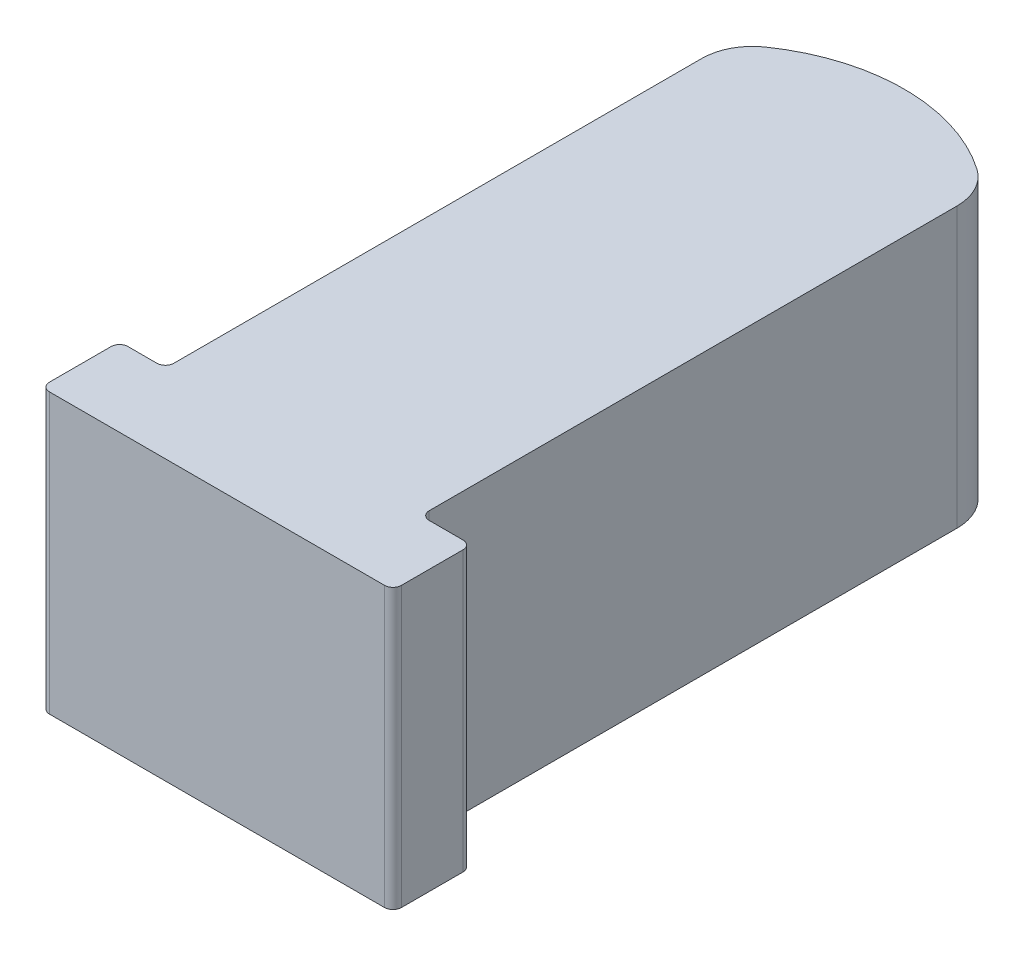
ISO-10303-21;
HEADER;
FILE_DESCRIPTION(('STEP AP214'),'2;1');
FILE_NAME('part.step','',(''),(''),'','','');
FILE_SCHEMA(('AUTOMOTIVE_DESIGN { 1 0 10303 214 1 1 1 1 }'));
ENDSEC;
DATA;
#1=APPLICATION_CONTEXT('core data for automotive mechanical design processes');
#2=APPLICATION_PROTOCOL_DEFINITION('international standard','automotive_design',2000,#1);
#3=PRODUCT_CONTEXT('',#1,'mechanical');
#4=PRODUCT('Part','Part','',(#3));
#5=PRODUCT_RELATED_PRODUCT_CATEGORY('part','',(#4));
#6=PRODUCT_DEFINITION_FORMATION('','',#4);
#7=PRODUCT_DEFINITION_CONTEXT('part definition',#1,'design');
#8=PRODUCT_DEFINITION('design','',#6,#7);
#9=PRODUCT_DEFINITION_SHAPE('','',#8);
#10=(LENGTH_UNIT() NAMED_UNIT(*) SI_UNIT(.MILLI.,.METRE.));
#11=(NAMED_UNIT(*) PLANE_ANGLE_UNIT() SI_UNIT($,.RADIAN.));
#12=(NAMED_UNIT(*) SI_UNIT($,.STERADIAN.) SOLID_ANGLE_UNIT());
#13=UNCERTAINTY_MEASURE_WITH_UNIT(LENGTH_MEASURE(1.E-05),#10,'distance_accuracy_value','');
#14=(GEOMETRIC_REPRESENTATION_CONTEXT(3) GLOBAL_UNCERTAINTY_ASSIGNED_CONTEXT((#13)) GLOBAL_UNIT_ASSIGNED_CONTEXT((#10,
#11,#12)) REPRESENTATION_CONTEXT('',''));
#15=CARTESIAN_POINT('',(0.,0.,0.));
#16=DIRECTION('',(0.,0.,1.));
#17=DIRECTION('',(1.,0.,0.));
#18=AXIS2_PLACEMENT_3D('',#15,#16,#17);
#19=CARTESIAN_POINT('',(-7.28235213915439,6.8,-3.32500001229346));
#20=DIRECTION('',(0.,-1.,0.));
#21=DIRECTION('',(0.,0.,-1.));
#22=AXIS2_PLACEMENT_3D('',#19,#20,#21);
#23=CYLINDRICAL_SURFACE('',#22,0.1);
#24=CARTESIAN_POINT('',(-7.28235213915439,6.8,-3.32500001229346));
#25=DIRECTION('',(0.,-1.,0.));
#26=DIRECTION('',(0.,0.,-1.));
#27=AXIS2_PLACEMENT_3D('',#24,#25,#26);
#28=CIRCLE('',#27,0.1);
#29=CARTESIAN_POINT('',(-7.28235213915439,6.8,-3.42500001229346));
#30=VERTEX_POINT('',#29);
#31=CARTESIAN_POINT('',(-7.18235213915439,6.8,-3.32500001229346));
#32=VERTEX_POINT('',#31);
#33=EDGE_CURVE('E137',#30,#32,#28,.T.);
#34=ORIENTED_EDGE('',*,*,#33,.T.);
#35=DIRECTION('',(0.,1.,0.));
#36=VECTOR('',#35,1.);
#37=CARTESIAN_POINT('',(-7.18235213915439,5.15,-3.32500001229346));
#38=LINE('',#37,#36);
#39=CARTESIAN_POINT('',(-7.18235213915439,3.5,-3.32500001229346));
#40=VERTEX_POINT('',#39);
#41=EDGE_CURVE('E139',#40,#32,#38,.T.);
#42=ORIENTED_EDGE('',*,*,#41,.F.);
#43=CARTESIAN_POINT('',(-7.28235213915439,3.5,-3.32500001229346));
#44=DIRECTION('',(0.,-1.,0.));
#45=DIRECTION('',(0.,0.,-1.));
#46=AXIS2_PLACEMENT_3D('',#43,#44,#45);
#47=CIRCLE('',#46,0.1);
#48=CARTESIAN_POINT('',(-7.28235213915439,3.5,-3.42500001229346));
#49=VERTEX_POINT('',#48);
#50=EDGE_CURVE('E21',#40,#49,#47,.F.);
#51=ORIENTED_EDGE('',*,*,#50,.T.);
#52=DIRECTION('',(0.,-1.,0.));
#53=VECTOR('',#52,1.);
#54=CARTESIAN_POINT('',(-7.28235213915439,5.15,-3.42500001229346));
#55=LINE('',#54,#53);
#56=EDGE_CURVE('E152',#30,#49,#55,.T.);
#57=ORIENTED_EDGE('',*,*,#56,.F.);
#58=EDGE_LOOP('',(#34,#42,#51,#57));
#59=FACE_BOUND('',#58,.T.);
#60=ADVANCED_FACE('F17',(#59),#23,.T.);
#61=CARTESIAN_POINT('',(-7.18235213915439,3.49,-2.58665948518661));
#62=DIRECTION('',(1.,0.,0.));
#63=DIRECTION('',(0.,0.,-1.));
#64=AXIS2_PLACEMENT_3D('',#61,#62,#63);
#65=PLANE('',#64);
#66=DIRECTION('',(0.,0.,1.));
#67=VECTOR('',#66,1.);
#68=CARTESIAN_POINT('',(-7.18235213915439,6.8,-2.96082974874003));
#69=LINE('',#68,#67);
#70=CARTESIAN_POINT('',(-7.18235213915439,6.8,-2.59665948518661));
#71=VERTEX_POINT('',#70);
#72=EDGE_CURVE('E142',#32,#71,#69,.T.);
#73=ORIENTED_EDGE('',*,*,#72,.T.);
#74=DIRECTION('',(0.,1.,0.));
#75=VECTOR('',#74,1.);
#76=CARTESIAN_POINT('',(-7.18235213915439,5.15,-2.59665948518661));
#77=LINE('',#76,#75);
#78=CARTESIAN_POINT('',(-7.18235213915439,3.5,-2.59665948518661));
#79=VERTEX_POINT('',#78);
#80=EDGE_CURVE('E146',#79,#71,#77,.T.);
#81=ORIENTED_EDGE('',*,*,#80,.F.);
#82=DIRECTION('',(0.,0.,-1.));
#83=VECTOR('',#82,1.);
#84=CARTESIAN_POINT('',(-7.18235213915439,3.5,-2.96082974874003));
#85=LINE('',#84,#83);
#86=EDGE_CURVE('E130',#79,#40,#85,.T.);
#87=ORIENTED_EDGE('',*,*,#86,.T.);
#88=ORIENTED_EDGE('',*,*,#41,.T.);
#89=EDGE_LOOP('',(#73,#81,#87,#88));
#90=FACE_BOUND('',#89,.T.);
#91=ADVANCED_FACE('F144',(#90),#65,.T.);
#92=CARTESIAN_POINT('',(-7.27235213915439,3.49,-3.42500001229346));
#93=DIRECTION('',(0.,0.,-1.));
#94=DIRECTION('',(-1.,0.,0.));
#95=AXIS2_PLACEMENT_3D('',#92,#93,#94);
#96=PLANE('',#95);
#97=DIRECTION('',(1.,0.,0.));
#98=VECTOR('',#97,1.);
#99=CARTESIAN_POINT('',(-7.48235213244887,6.8,-3.42500001229346));
#100=LINE('',#99,#98);
#101=CARTESIAN_POINT('',(-7.68235212574335,6.8,-3.42500001229346));
#102=VERTEX_POINT('',#101);
#103=EDGE_CURVE('E154',#102,#30,#100,.T.);
#104=ORIENTED_EDGE('',*,*,#103,.T.);
#105=ORIENTED_EDGE('',*,*,#56,.T.);
#106=DIRECTION('',(-1.,0.,0.));
#107=VECTOR('',#106,1.);
#108=CARTESIAN_POINT('',(-7.48235213244887,3.5,-3.42500001229346));
#109=LINE('',#108,#107);
#110=CARTESIAN_POINT('',(-7.68235212574334,3.5,-3.42500001229346));
#111=VERTEX_POINT('',#110);
#112=EDGE_CURVE('E133',#49,#111,#109,.T.);
#113=ORIENTED_EDGE('',*,*,#112,.T.);
#114=DIRECTION('',(0.,-1.,0.));
#115=VECTOR('',#114,1.);
#116=CARTESIAN_POINT('',(-7.68235212574334,5.15,-3.42500001229346));
#117=LINE('',#116,#115);
#118=EDGE_CURVE('E193',#102,#111,#117,.T.);
#119=ORIENTED_EDGE('',*,*,#118,.F.);
#120=EDGE_LOOP('',(#104,#105,#113,#119));
#121=FACE_BOUND('',#120,.T.);
#122=ADVANCED_FACE('F291',(#121),#96,.T.);
#123=CARTESIAN_POINT('',(-7.28235213915439,6.8,-2.59665948518661));
#124=DIRECTION('',(0.,-1.,0.));
#125=DIRECTION('',(0.,0.,-1.));
#126=AXIS2_PLACEMENT_3D('',#123,#124,#125);
#127=CYLINDRICAL_SURFACE('',#126,0.1);
#128=CARTESIAN_POINT('',(-7.28235213915439,6.8,-2.59665948518661));
#129=DIRECTION('',(0.,-1.,0.));
#130=DIRECTION('',(0.,0.,-1.));
#131=AXIS2_PLACEMENT_3D('',#128,#129,#130);
#132=CIRCLE('',#131,0.1);
#133=CARTESIAN_POINT('',(-7.28235213915439,6.8,-2.49665948518661));
#134=VERTEX_POINT('',#133);
#135=EDGE_CURVE('E199',#71,#134,#132,.T.);
#136=ORIENTED_EDGE('',*,*,#135,.T.);
#137=DIRECTION('',(0.,1.,0.));
#138=VECTOR('',#137,1.);
#139=CARTESIAN_POINT('',(-7.28235213915439,5.15,-2.49665948518661));
#140=LINE('',#139,#138);
#141=CARTESIAN_POINT('',(-7.28235213915439,3.5,-2.49665948518661));
#142=VERTEX_POINT('',#141);
#143=EDGE_CURVE('E190',#142,#134,#140,.T.);
#144=ORIENTED_EDGE('',*,*,#143,.F.);
#145=CARTESIAN_POINT('',(-7.28235213915439,3.5,-2.59665948518661));
#146=DIRECTION('',(0.,-1.,0.));
#147=DIRECTION('',(0.,0.,-1.));
#148=AXIS2_PLACEMENT_3D('',#145,#146,#147);
#149=CIRCLE('',#148,0.1);
#150=EDGE_CURVE('E153',#142,#79,#149,.F.);
#151=ORIENTED_EDGE('',*,*,#150,.T.);
#152=ORIENTED_EDGE('',*,*,#80,.T.);
#153=EDGE_LOOP('',(#136,#144,#151,#152));
#154=FACE_BOUND('',#153,.T.);
#155=ADVANCED_FACE('F294',(#154),#127,.T.);
#156=CARTESIAN_POINT('',(-7.68235212574334,3.5,-3.52500001229346));
#157=DIRECTION('',(0.,1.,0.));
#158=DIRECTION('',(0.,0.,1.));
#159=AXIS2_PLACEMENT_3D('',#156,#157,#158);
#160=CYLINDRICAL_SURFACE('',#159,0.100000000000006);
#161=CARTESIAN_POINT('',(-7.68235212574336,6.8,-3.52500001229345));
#162=DIRECTION('',(0.,1.,0.));
#163=DIRECTION('',(0.,0.,1.));
#164=AXIS2_PLACEMENT_3D('',#161,#162,#163);
#165=CIRCLE('',#164,0.100000000000006);
#166=CARTESIAN_POINT('',(-7.78235212574335,6.8,-3.52500001229345));
#167=VERTEX_POINT('',#166);
#168=EDGE_CURVE('E194',#167,#102,#165,.T.);
#169=ORIENTED_EDGE('',*,*,#168,.T.);
#170=ORIENTED_EDGE('',*,*,#118,.T.);
#171=CARTESIAN_POINT('',(-7.68235212574334,3.5,-3.52500001229346));
#172=DIRECTION('',(0.,1.,0.));
#173=DIRECTION('',(0.,0.,1.));
#174=AXIS2_PLACEMENT_3D('',#171,#172,#173);
#175=CIRCLE('',#174,0.100000000000006);
#176=CARTESIAN_POINT('',(-7.78235212574336,3.5,-3.52500001229346));
#177=VERTEX_POINT('',#176);
#178=EDGE_CURVE('E197',#111,#177,#175,.F.);
#179=ORIENTED_EDGE('',*,*,#178,.T.);
#180=DIRECTION('',(0.,-1.,0.));
#181=VECTOR('',#180,1.);
#182=CARTESIAN_POINT('',(-7.78235212574335,5.15,-3.52500001229346));
#183=LINE('',#182,#181);
#184=EDGE_CURVE('E216',#167,#177,#183,.T.);
#185=ORIENTED_EDGE('',*,*,#184,.F.);
#186=EDGE_LOOP('',(#169,#170,#179,#185));
#187=FACE_BOUND('',#186,.T.);
#188=ADVANCED_FACE('F288',(#187),#160,.F.);
#189=CARTESIAN_POINT('',(-8.38235212574329,6.8,-9.76718775769763));
#190=DIRECTION('',(0.,-1.,0.));
#191=DIRECTION('',(0.,0.,-1.));
#192=AXIS2_PLACEMENT_3D('',#189,#190,#191);
#193=CYLINDRICAL_SURFACE('',#192,0.599999999999941);
#194=CARTESIAN_POINT('',(-8.38235212574329,6.8,-9.76718775769763));
#195=DIRECTION('',(0.,-1.,0.));
#196=DIRECTION('',(0.,0.,-1.));
#197=AXIS2_PLACEMENT_3D('',#194,#195,#196);
#198=CIRCLE('',#197,0.599999999999941);
#199=CARTESIAN_POINT('',(-8.04095619473779,6.8,-10.2605930862996));
#200=VERTEX_POINT('',#199);
#201=CARTESIAN_POINT('',(-7.78235212574336,6.8,-9.76718775769762));
#202=VERTEX_POINT('',#201);
#203=EDGE_CURVE('E188',#200,#202,#198,.T.);
#204=ORIENTED_EDGE('',*,*,#203,.T.);
#205=DIRECTION('',(0.,1.,0.));
#206=VECTOR('',#205,1.);
#207=CARTESIAN_POINT('',(-7.78235212574336,5.15,-9.76718775769761));
#208=LINE('',#207,#206);
#209=CARTESIAN_POINT('',(-7.78235212574336,3.5,-9.76718775769762));
#210=VERTEX_POINT('',#209);
#211=EDGE_CURVE('E213',#210,#202,#208,.T.);
#212=ORIENTED_EDGE('',*,*,#211,.F.);
#213=CARTESIAN_POINT('',(-8.38235212574329,3.5,-9.76718775769763));
#214=DIRECTION('',(0.,-1.,0.));
#215=DIRECTION('',(0.,0.,-1.));
#216=AXIS2_PLACEMENT_3D('',#213,#214,#215);
#217=CIRCLE('',#216,0.599999999999941);
#218=CARTESIAN_POINT('',(-8.04095619473779,3.5,-10.2605930862996));
#219=VERTEX_POINT('',#218);
#220=EDGE_CURVE('E191',#210,#219,#217,.F.);
#221=ORIENTED_EDGE('',*,*,#220,.T.);
#222=DIRECTION('',(0.,-1.,0.));
#223=VECTOR('',#222,1.);
#224=CARTESIAN_POINT('',(-8.04095619473745,5.15,-10.2605930862994));
#225=LINE('',#224,#223);
#226=EDGE_CURVE('E210',#200,#219,#225,.T.);
#227=ORIENTED_EDGE('',*,*,#226,.F.);
#228=EDGE_LOOP('',(#204,#212,#221,#227));
#229=FACE_BOUND('',#228,.T.);
#230=ADVANCED_FACE('F282',(#229),#193,.T.);
#231=CARTESIAN_POINT('',(-11.2541460953288,3.49,-2.49665948518661));
#232=DIRECTION('',(0.,0.,1.));
#233=DIRECTION('',(1.,0.,0.));
#234=AXIS2_PLACEMENT_3D('',#231,#232,#233);
#235=PLANE('',#234);
#236=DIRECTION('',(1.,0.,0.));
#237=VECTOR('',#236,1.);
#238=CARTESIAN_POINT('',(-9.2632491172416,6.8,-2.49665948518661));
#239=LINE('',#238,#237);
#240=CARTESIAN_POINT('',(-11.2441460953288,6.8,-2.49665948518661));
#241=VERTEX_POINT('',#240);
#242=EDGE_CURVE('E171',#241,#134,#239,.T.);
#243=ORIENTED_EDGE('',*,*,#242,.F.);
#244=DIRECTION('',(0.,1.,0.));
#245=VECTOR('',#244,1.);
#246=CARTESIAN_POINT('',(-11.2441460953288,5.15,-2.49665948518661));
#247=LINE('',#246,#245);
#248=CARTESIAN_POINT('',(-11.2441460953288,3.5,-2.49665948518661));
#249=VERTEX_POINT('',#248);
#250=EDGE_CURVE('E187',#249,#241,#247,.T.);
#251=ORIENTED_EDGE('',*,*,#250,.F.);
#252=DIRECTION('',(-1.,0.,0.));
#253=VECTOR('',#252,1.);
#254=CARTESIAN_POINT('',(-9.2632491172416,3.5,-2.49665948518661));
#255=LINE('',#254,#253);
#256=EDGE_CURVE('E176',#142,#249,#255,.T.);
#257=ORIENTED_EDGE('',*,*,#256,.F.);
#258=ORIENTED_EDGE('',*,*,#143,.T.);
#259=EDGE_LOOP('',(#243,#251,#257,#258));
#260=FACE_BOUND('',#259,.T.);
#261=ADVANCED_FACE('F297',(#260),#235,.T.);
#262=CARTESIAN_POINT('',(-7.78235212574335,3.49,-3.51500001229346));
#263=DIRECTION('',(1.,0.,0.));
#264=DIRECTION('',(0.,0.,-1.));
#265=AXIS2_PLACEMENT_3D('',#262,#263,#264);
#266=PLANE('',#265);
#267=DIRECTION('',(0.,0.,-1.));
#268=VECTOR('',#267,1.);
#269=CARTESIAN_POINT('',(-7.78235212574335,6.8,-6.81149957205211));
#270=LINE('',#269,#268);
#271=EDGE_CURVE('E167',#167,#202,#270,.T.);
#272=ORIENTED_EDGE('',*,*,#271,.F.);
#273=ORIENTED_EDGE('',*,*,#184,.T.);
#274=DIRECTION('',(0.,0.,1.));
#275=VECTOR('',#274,1.);
#276=CARTESIAN_POINT('',(-7.78235212574336,3.5,-6.81149957205211));
#277=LINE('',#276,#275);
#278=EDGE_CURVE('E180',#210,#177,#277,.T.);
#279=ORIENTED_EDGE('',*,*,#278,.F.);
#280=ORIENTED_EDGE('',*,*,#211,.T.);
#281=EDGE_LOOP('',(#272,#273,#279,#280));
#282=FACE_BOUND('',#281,.T.);
#283=ADVANCED_FACE('F285',(#282),#266,.T.);
#284=CARTESIAN_POINT('',(-9.29218367976023,6.8,-8.45224608407934));
#285=DIRECTION('',(0.,-1.,0.));
#286=DIRECTION('',(0.,0.,-1.));
#287=AXIS2_PLACEMENT_3D('',#284,#285,#286);
#288=CYLINDRICAL_SURFACE('',#287,2.19902003167654);
#289=CARTESIAN_POINT('',(-9.29218367976023,6.8,-8.45224608407934));
#290=DIRECTION('',(0.,-1.,0.));
#291=DIRECTION('',(0.,0.,-1.));
#292=AXIS2_PLACEMENT_3D('',#289,#290,#291);
#293=CIRCLE('',#292,2.19902003167654);
#294=CARTESIAN_POINT('',(-10.5434111647827,6.8,-10.2605930862996));
#295=VERTEX_POINT('',#294);
#296=EDGE_CURVE('E165',#200,#295,#293,.F.);
#297=ORIENTED_EDGE('',*,*,#296,.F.);
#298=ORIENTED_EDGE('',*,*,#226,.T.);
#299=CARTESIAN_POINT('',(-9.29218367976023,3.5,-8.45224608407934));
#300=DIRECTION('',(0.,-1.,0.));
#301=DIRECTION('',(0.,0.,-1.));
#302=AXIS2_PLACEMENT_3D('',#299,#300,#301);
#303=CIRCLE('',#302,2.19902003167654);
#304=CARTESIAN_POINT('',(-10.5434111647827,3.5,-10.2605930862996));
#305=VERTEX_POINT('',#304);
#306=EDGE_CURVE('E177',#305,#219,#303,.T.);
#307=ORIENTED_EDGE('',*,*,#306,.F.);
#308=DIRECTION('',(0.,-1.,0.));
#309=VECTOR('',#308,1.);
#310=CARTESIAN_POINT('',(-10.543411164783,5.15,-10.2605930862994));
#311=LINE('',#310,#309);
#312=EDGE_CURVE('E159',#295,#305,#311,.T.);
#313=ORIENTED_EDGE('',*,*,#312,.F.);
#314=EDGE_LOOP('',(#297,#298,#307,#313));
#315=FACE_BOUND('',#314,.T.);
#316=ADVANCED_FACE('F278',(#315),#288,.T.);
#317=CARTESIAN_POINT('',(-11.2441460953288,6.8,-2.59665948518661));
#318=DIRECTION('',(0.,-1.,0.));
#319=DIRECTION('',(0.,0.,-1.));
#320=AXIS2_PLACEMENT_3D('',#317,#318,#319);
#321=CYLINDRICAL_SURFACE('',#320,0.100000000000001);
#322=CARTESIAN_POINT('',(-11.2441460953288,6.8,-2.59665948518661));
#323=DIRECTION('',(0.,-1.,0.));
#324=DIRECTION('',(0.,0.,-1.));
#325=AXIS2_PLACEMENT_3D('',#322,#323,#324);
#326=CIRCLE('',#325,0.100000000000001);
#327=CARTESIAN_POINT('',(-11.3441460953288,6.8,-2.59665948518661));
#328=VERTEX_POINT('',#327);
#329=EDGE_CURVE('E168',#328,#241,#326,.F.);
#330=ORIENTED_EDGE('',*,*,#329,.F.);
#331=DIRECTION('',(0.,1.,0.));
#332=VECTOR('',#331,1.);
#333=CARTESIAN_POINT('',(-11.3441460953288,5.15,-2.59665948518661));
#334=LINE('',#333,#332);
#335=CARTESIAN_POINT('',(-11.3441460953288,3.5,-2.59665948518662));
#336=VERTEX_POINT('',#335);
#337=EDGE_CURVE('E229',#336,#328,#334,.T.);
#338=ORIENTED_EDGE('',*,*,#337,.F.);
#339=CARTESIAN_POINT('',(-11.2441460953288,3.5,-2.59665948518664));
#340=DIRECTION('',(0.,-1.,0.));
#341=DIRECTION('',(0.,0.,-1.));
#342=AXIS2_PLACEMENT_3D('',#339,#340,#341);
#343=CIRCLE('',#342,0.100000000000001);
#344=EDGE_CURVE('E174',#249,#336,#343,.T.);
#345=ORIENTED_EDGE('',*,*,#344,.F.);
#346=ORIENTED_EDGE('',*,*,#250,.T.);
#347=EDGE_LOOP('',(#330,#338,#345,#346));
#348=FACE_BOUND('',#347,.T.);
#349=ADVANCED_FACE('F303',(#348),#321,.T.);
#350=CARTESIAN_POINT('',(-7.17235213915439,3.5,-2.48665948518661));
#351=DIRECTION('',(0.,-1.,0.));
#352=DIRECTION('',(-1.,0.,0.));
#353=AXIS2_PLACEMENT_3D('',#350,#351,#352);
#354=PLANE('',#353);
#355=ORIENTED_EDGE('',*,*,#344,.T.);
#356=DIRECTION('',(0.,0.,1.));
#357=VECTOR('',#356,1.);
#358=CARTESIAN_POINT('',(-11.3441460953288,3.5,-2.96082974874003));
#359=LINE('',#358,#357);
#360=CARTESIAN_POINT('',(-11.3441460953288,3.5,-3.32500001229346));
#361=VERTEX_POINT('',#360);
#362=EDGE_CURVE('E226',#361,#336,#359,.T.);
#363=ORIENTED_EDGE('',*,*,#362,.F.);
#364=CARTESIAN_POINT('',(-11.2441460953288,3.5,-3.32500001229346));
#365=DIRECTION('',(0.,-1.,0.));
#366=DIRECTION('',(0.,0.,-1.));
#367=AXIS2_PLACEMENT_3D('',#364,#365,#366);
#368=CIRCLE('',#367,0.100000000000001);
#369=CARTESIAN_POINT('',(-11.2441460953288,3.5,-3.42500001229346));
#370=VERTEX_POINT('',#369);
#371=EDGE_CURVE('E184',#361,#370,#368,.T.);
#372=ORIENTED_EDGE('',*,*,#371,.T.);
#373=DIRECTION('',(1.,0.,0.));
#374=VECTOR('',#373,1.);
#375=CARTESIAN_POINT('',(-9.2632491172416,3.5,-3.42500001229346));
#376=LINE('',#375,#374);
#377=CARTESIAN_POINT('',(-10.9020152337772,3.5,-3.42500001229346));
#378=VERTEX_POINT('',#377);
#379=EDGE_CURVE('E183',#370,#378,#376,.T.);
#380=ORIENTED_EDGE('',*,*,#379,.T.);
#381=CARTESIAN_POINT('',(-10.9020152337772,3.5,-3.52500001229346));
#382=DIRECTION('',(0.,1.,0.));
#383=DIRECTION('',(0.,0.,1.));
#384=AXIS2_PLACEMENT_3D('',#381,#382,#383);
#385=CIRCLE('',#384,0.100000000000001);
#386=CARTESIAN_POINT('',(-10.8020152337772,3.5,-3.52500001229346));
#387=VERTEX_POINT('',#386);
#388=EDGE_CURVE('E181',#378,#387,#385,.T.);
#389=ORIENTED_EDGE('',*,*,#388,.T.);
#390=DIRECTION('',(0.,0.,1.));
#391=VECTOR('',#390,1.);
#392=CARTESIAN_POINT('',(-10.8020152337772,3.5,-6.64609388499551));
#393=LINE('',#392,#391);
#394=CARTESIAN_POINT('',(-10.8020152337772,3.5,-9.76718775769756));
#395=VERTEX_POINT('',#394);
#396=EDGE_CURVE('E237',#395,#387,#393,.T.);
#397=ORIENTED_EDGE('',*,*,#396,.F.);
#398=CARTESIAN_POINT('',(-10.2020152337772,3.5,-9.76718775769756));
#399=DIRECTION('',(0.,-1.,0.));
#400=DIRECTION('',(0.,0.,-1.));
#401=AXIS2_PLACEMENT_3D('',#398,#399,#400);
#402=CIRCLE('',#401,0.599999999999967);
#403=EDGE_CURVE('E160',#305,#395,#402,.F.);
#404=ORIENTED_EDGE('',*,*,#403,.F.);
#405=ORIENTED_EDGE('',*,*,#306,.T.);
#406=ORIENTED_EDGE('',*,*,#220,.F.);
#407=ORIENTED_EDGE('',*,*,#278,.T.);
#408=ORIENTED_EDGE('',*,*,#178,.F.);
#409=ORIENTED_EDGE('',*,*,#112,.F.);
#410=ORIENTED_EDGE('',*,*,#50,.F.);
#411=ORIENTED_EDGE('',*,*,#86,.F.);
#412=ORIENTED_EDGE('',*,*,#150,.F.);
#413=ORIENTED_EDGE('',*,*,#256,.T.);
#414=EDGE_LOOP('',(#355,#363,#372,#380,#389,#397,#404,#405,#406,#407,#408,#409,#410,#411,#412,#413));
#415=FACE_BOUND('',#414,.T.);
#416=ADVANCED_FACE('F128',(#415),#354,.T.);
#417=CARTESIAN_POINT('',(-11.3541460953288,6.8,-2.48665948518661));
#418=DIRECTION('',(0.,1.,0.));
#419=DIRECTION('',(1.,0.,0.));
#420=AXIS2_PLACEMENT_3D('',#417,#418,#419);
#421=PLANE('',#420);
#422=CARTESIAN_POINT('',(-10.9020152337772,6.8,-3.52500001229345));
#423=DIRECTION('',(0.,1.,0.));
#424=DIRECTION('',(0.,0.,1.));
#425=AXIS2_PLACEMENT_3D('',#422,#423,#424);
#426=CIRCLE('',#425,0.100000000000001);
#427=CARTESIAN_POINT('',(-10.8020152337772,6.8,-3.52500001229345));
#428=VERTEX_POINT('',#427);
#429=CARTESIAN_POINT('',(-10.9020152337772,6.8,-3.42500001229346));
#430=VERTEX_POINT('',#429);
#431=EDGE_CURVE('E36',#428,#430,#426,.F.);
#432=ORIENTED_EDGE('',*,*,#431,.T.);
#433=DIRECTION('',(-1.,0.,0.));
#434=VECTOR('',#433,1.);
#435=CARTESIAN_POINT('',(-9.2632491172416,6.8,-3.42500001229346));
#436=LINE('',#435,#434);
#437=CARTESIAN_POINT('',(-11.2441460953288,6.8,-3.42500001229346));
#438=VERTEX_POINT('',#437);
#439=EDGE_CURVE('E163',#430,#438,#436,.T.);
#440=ORIENTED_EDGE('',*,*,#439,.T.);
#441=CARTESIAN_POINT('',(-11.2441460953288,6.8,-3.32500001229346));
#442=DIRECTION('',(0.,-1.,0.));
#443=DIRECTION('',(0.,0.,-1.));
#444=AXIS2_PLACEMENT_3D('',#441,#442,#443);
#445=CIRCLE('',#444,0.100000000000001);
#446=CARTESIAN_POINT('',(-11.3441460953288,6.8,-3.32500001229346));
#447=VERTEX_POINT('',#446);
#448=EDGE_CURVE('E172',#438,#447,#445,.F.);
#449=ORIENTED_EDGE('',*,*,#448,.T.);
#450=DIRECTION('',(0.,0.,-1.));
#451=VECTOR('',#450,1.);
#452=CARTESIAN_POINT('',(-11.3441460953288,6.8,-2.96082974874003));
#453=LINE('',#452,#451);
#454=EDGE_CURVE('E234',#328,#447,#453,.T.);
#455=ORIENTED_EDGE('',*,*,#454,.F.);
#456=ORIENTED_EDGE('',*,*,#329,.T.);
#457=ORIENTED_EDGE('',*,*,#242,.T.);
#458=ORIENTED_EDGE('',*,*,#135,.F.);
#459=ORIENTED_EDGE('',*,*,#72,.F.);
#460=ORIENTED_EDGE('',*,*,#33,.F.);
#461=ORIENTED_EDGE('',*,*,#103,.F.);
#462=ORIENTED_EDGE('',*,*,#168,.F.);
#463=ORIENTED_EDGE('',*,*,#271,.T.);
#464=ORIENTED_EDGE('',*,*,#203,.F.);
#465=ORIENTED_EDGE('',*,*,#296,.T.);
#466=CARTESIAN_POINT('',(-10.2020152337772,6.8,-9.76718775769756));
#467=DIRECTION('',(0.,-1.,0.));
#468=DIRECTION('',(0.,0.,-1.));
#469=AXIS2_PLACEMENT_3D('',#466,#467,#468);
#470=CIRCLE('',#469,0.599999999999967);
#471=CARTESIAN_POINT('',(-10.8020152337772,6.8,-9.76718775769756));
#472=VERTEX_POINT('',#471);
#473=EDGE_CURVE('E156',#472,#295,#470,.T.);
#474=ORIENTED_EDGE('',*,*,#473,.F.);
#475=DIRECTION('',(0.,0.,-1.));
#476=VECTOR('',#475,1.);
#477=CARTESIAN_POINT('',(-10.8020152337772,6.8,-6.64609388499551));
#478=LINE('',#477,#476);
#479=EDGE_CURVE('E242',#428,#472,#478,.T.);
#480=ORIENTED_EDGE('',*,*,#479,.F.);
#481=EDGE_LOOP('',(#432,#440,#449,#455,#456,#457,#458,#459,#460,#461,#462,#463,#464,#465,#474,#480));
#482=FACE_BOUND('',#481,.T.);
#483=ADVANCED_FACE('F260',(#482),#421,.T.);
#484=CARTESIAN_POINT('',(-10.2020152337772,6.8,-9.76718775769756));
#485=DIRECTION('',(0.,-1.,0.));
#486=DIRECTION('',(0.,0.,-1.));
#487=AXIS2_PLACEMENT_3D('',#484,#485,#486);
#488=CYLINDRICAL_SURFACE('',#487,0.599999999999967);
#489=ORIENTED_EDGE('',*,*,#473,.T.);
#490=ORIENTED_EDGE('',*,*,#312,.T.);
#491=ORIENTED_EDGE('',*,*,#403,.T.);
#492=DIRECTION('',(0.,-1.,0.));
#493=VECTOR('',#492,1.);
#494=CARTESIAN_POINT('',(-10.8020152337772,5.15,-9.76718775769756));
#495=LINE('',#494,#493);
#496=EDGE_CURVE('E233',#472,#395,#495,.T.);
#497=ORIENTED_EDGE('',*,*,#496,.F.);
#498=EDGE_LOOP('',(#489,#490,#491,#497));
#499=FACE_BOUND('',#498,.T.);
#500=ADVANCED_FACE('F272',(#499),#488,.T.);
#501=CARTESIAN_POINT('',(-11.3441460953288,3.49,-3.33500001229346));
#502=DIRECTION('',(-1.,0.,0.));
#503=DIRECTION('',(0.,0.,1.));
#504=AXIS2_PLACEMENT_3D('',#501,#502,#503);
#505=PLANE('',#504);
#506=ORIENTED_EDGE('',*,*,#454,.T.);
#507=DIRECTION('',(0.,1.,0.));
#508=VECTOR('',#507,1.);
#509=CARTESIAN_POINT('',(-11.3441460953288,5.15,-3.32500001229346));
#510=LINE('',#509,#508);
#511=EDGE_CURVE('E230',#361,#447,#510,.T.);
#512=ORIENTED_EDGE('',*,*,#511,.F.);
#513=ORIENTED_EDGE('',*,*,#362,.T.);
#514=ORIENTED_EDGE('',*,*,#337,.T.);
#515=EDGE_LOOP('',(#506,#512,#513,#514));
#516=FACE_BOUND('',#515,.T.);
#517=ADVANCED_FACE('F305',(#516),#505,.T.);
#518=CARTESIAN_POINT('',(-10.8020152337772,3.49,-9.77718775769756));
#519=DIRECTION('',(-1.,0.,0.));
#520=DIRECTION('',(0.,0.,1.));
#521=AXIS2_PLACEMENT_3D('',#518,#519,#520);
#522=PLANE('',#521);
#523=ORIENTED_EDGE('',*,*,#479,.T.);
#524=ORIENTED_EDGE('',*,*,#496,.T.);
#525=ORIENTED_EDGE('',*,*,#396,.T.);
#526=DIRECTION('',(0.,-1.,0.));
#527=VECTOR('',#526,1.);
#528=CARTESIAN_POINT('',(-10.8020152337772,5.15,-3.52500001229346));
#529=LINE('',#528,#527);
#530=EDGE_CURVE('E222',#428,#387,#529,.T.);
#531=ORIENTED_EDGE('',*,*,#530,.F.);
#532=EDGE_LOOP('',(#523,#524,#525,#531));
#533=FACE_BOUND('',#532,.T.);
#534=ADVANCED_FACE('F269',(#533),#522,.T.);
#535=CARTESIAN_POINT('',(-11.2441460953288,6.8,-3.32500001229346));
#536=DIRECTION('',(0.,-1.,0.));
#537=DIRECTION('',(0.,0.,-1.));
#538=AXIS2_PLACEMENT_3D('',#535,#536,#537);
#539=CYLINDRICAL_SURFACE('',#538,0.100000000000001);
#540=ORIENTED_EDGE('',*,*,#448,.F.);
#541=DIRECTION('',(0.,1.,0.));
#542=VECTOR('',#541,1.);
#543=CARTESIAN_POINT('',(-11.2441460953288,5.15,-3.42500001229346));
#544=LINE('',#543,#542);
#545=EDGE_CURVE('E27',#370,#438,#544,.T.);
#546=ORIENTED_EDGE('',*,*,#545,.F.);
#547=ORIENTED_EDGE('',*,*,#371,.F.);
#548=ORIENTED_EDGE('',*,*,#511,.T.);
#549=EDGE_LOOP('',(#540,#546,#547,#548));
#550=FACE_BOUND('',#549,.T.);
#551=ADVANCED_FACE('F307',(#550),#539,.T.);
#552=CARTESIAN_POINT('',(-10.9020152337772,3.5,-3.52500001229346));
#553=DIRECTION('',(0.,1.,0.));
#554=DIRECTION('',(0.,0.,1.));
#555=AXIS2_PLACEMENT_3D('',#552,#553,#554);
#556=CYLINDRICAL_SURFACE('',#555,0.100000000000001);
#557=ORIENTED_EDGE('',*,*,#431,.F.);
#558=ORIENTED_EDGE('',*,*,#530,.T.);
#559=ORIENTED_EDGE('',*,*,#388,.F.);
#560=DIRECTION('',(0.,-1.,0.));
#561=VECTOR('',#560,1.);
#562=CARTESIAN_POINT('',(-10.9020152337772,5.15,-3.42500001229346));
#563=LINE('',#562,#561);
#564=EDGE_CURVE('E11',#430,#378,#563,.T.);
#565=ORIENTED_EDGE('',*,*,#564,.F.);
#566=EDGE_LOOP('',(#557,#558,#559,#565));
#567=FACE_BOUND('',#566,.T.);
#568=ADVANCED_FACE('F264',(#567),#556,.F.);
#569=CARTESIAN_POINT('',(-10.8920152337772,3.49,-3.42500001229346));
#570=DIRECTION('',(0.,0.,-1.));
#571=DIRECTION('',(-1.,0.,0.));
#572=AXIS2_PLACEMENT_3D('',#569,#570,#571);
#573=PLANE('',#572);
#574=ORIENTED_EDGE('',*,*,#439,.F.);
#575=ORIENTED_EDGE('',*,*,#564,.T.);
#576=ORIENTED_EDGE('',*,*,#379,.F.);
#577=ORIENTED_EDGE('',*,*,#545,.T.);
#578=EDGE_LOOP('',(#574,#575,#576,#577));
#579=FACE_BOUND('',#578,.T.);
#580=ADVANCED_FACE('F19',(#579),#573,.T.);
#581=CLOSED_SHELL('',(#60,#91,#122,#155,#188,#230,#261,#283,#316,#349,#416,#483,#500,#517,#534,
#551,#568,#580));
#582=MANIFOLD_SOLID_BREP('B1',#581);
#583=ADVANCED_BREP_SHAPE_REPRESENTATION('',(#18,#582),#14);
#584=SHAPE_DEFINITION_REPRESENTATION(#9,#583);
ENDSEC;
END-ISO-10303-21;
